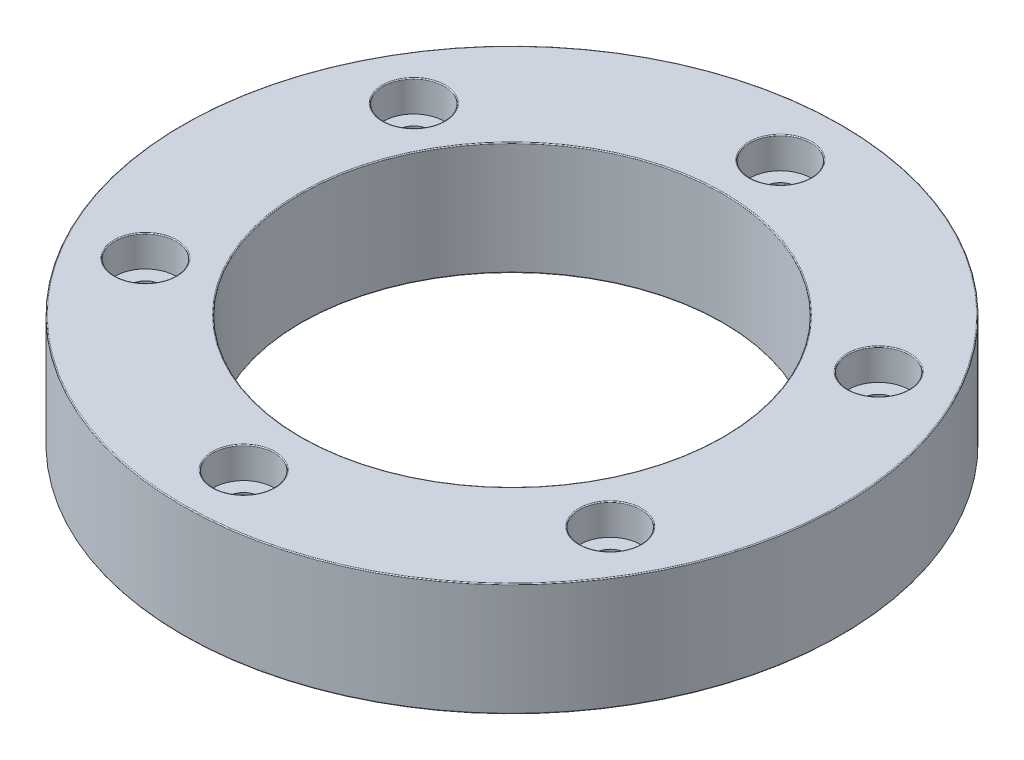
ISO-10303-21;
HEADER;
FILE_DESCRIPTION(('STEP AP214'),'2;1');
FILE_NAME('part.step','',(''),(''),'','','');
FILE_SCHEMA(('AUTOMOTIVE_DESIGN { 1 0 10303 214 1 1 1 1 }'));
ENDSEC;
DATA;
#1=APPLICATION_CONTEXT('core data for automotive mechanical design processes');
#2=APPLICATION_PROTOCOL_DEFINITION('international standard','automotive_design',2000,#1);
#3=PRODUCT_CONTEXT('',#1,'mechanical');
#4=PRODUCT('Part','Part','',(#3));
#5=PRODUCT_RELATED_PRODUCT_CATEGORY('part','',(#4));
#6=PRODUCT_DEFINITION_FORMATION('','',#4);
#7=PRODUCT_DEFINITION_CONTEXT('part definition',#1,'design');
#8=PRODUCT_DEFINITION('design','',#6,#7);
#9=PRODUCT_DEFINITION_SHAPE('','',#8);
#10=(LENGTH_UNIT() NAMED_UNIT(*) SI_UNIT(.MILLI.,.METRE.));
#11=(NAMED_UNIT(*) PLANE_ANGLE_UNIT() SI_UNIT($,.RADIAN.));
#12=(NAMED_UNIT(*) SI_UNIT($,.STERADIAN.) SOLID_ANGLE_UNIT());
#13=UNCERTAINTY_MEASURE_WITH_UNIT(LENGTH_MEASURE(1.E-05),#10,'distance_accuracy_value','');
#14=(GEOMETRIC_REPRESENTATION_CONTEXT(3) GLOBAL_UNCERTAINTY_ASSIGNED_CONTEXT((#13)) GLOBAL_UNIT_ASSIGNED_CONTEXT((#10,
#11,#12)) REPRESENTATION_CONTEXT('',''));
#15=CARTESIAN_POINT('',(0.,0.,0.));
#16=DIRECTION('',(0.,0.,1.));
#17=DIRECTION('',(1.,0.,0.));
#18=AXIS2_PLACEMENT_3D('',#15,#16,#17);
#19=CARTESIAN_POINT('',(0.,12.,0.));
#20=DIRECTION('',(0.,1.,0.));
#21=DIRECTION('',(0.,0.,1.));
#22=AXIS2_PLACEMENT_3D('',#19,#20,#21);
#23=PLANE('',#22);
#24=CARTESIAN_POINT('',(-24.6817240078563,12.,-14.2500000000003));
#25=DIRECTION('',(0.,1.,0.));
#26=DIRECTION('',(0.,0.,1.));
#27=AXIS2_PLACEMENT_3D('',#24,#25,#26);
#28=CIRCLE('',#27,3.35);
#29=CARTESIAN_POINT('',(-24.6817240078563,12.,-10.9000000000003));
#30=VERTEX_POINT('',#29);
#31=EDGE_CURVE('E62',#30,#30,#28,.F.);
#32=ORIENTED_EDGE('',*,*,#31,.T.);
#33=EDGE_LOOP('',(#32));
#34=FACE_BOUND('',#33,.T.);
#35=CARTESIAN_POINT('',(-24.6817240078566,12.,14.2499999999998));
#36=DIRECTION('',(0.,1.,0.));
#37=DIRECTION('',(0.,0.,1.));
#38=AXIS2_PLACEMENT_3D('',#35,#36,#37);
#39=CIRCLE('',#38,3.35);
#40=CARTESIAN_POINT('',(-24.6817240078566,12.,17.5999999999998));
#41=VERTEX_POINT('',#40);
#42=EDGE_CURVE('E65',#41,#41,#39,.F.);
#43=ORIENTED_EDGE('',*,*,#42,.T.);
#44=EDGE_LOOP('',(#43));
#45=FACE_BOUND('',#44,.T.);
#46=CARTESIAN_POINT('',(-1.99014436314059E-13,12.,28.5));
#47=DIRECTION('',(0.,1.,0.));
#48=DIRECTION('',(0.,0.,1.));
#49=AXIS2_PLACEMENT_3D('',#46,#47,#48);
#50=CIRCLE('',#49,3.35);
#51=CARTESIAN_POINT('',(-1.99014436314059E-13,12.,31.85));
#52=VERTEX_POINT('',#51);
#53=EDGE_CURVE('E68',#52,#52,#50,.F.);
#54=ORIENTED_EDGE('',*,*,#53,.T.);
#55=EDGE_LOOP('',(#54));
#56=FACE_BOUND('',#55,.T.);
#57=CARTESIAN_POINT('',(0.,12.,-28.5));
#58=DIRECTION('',(0.,1.,0.));
#59=DIRECTION('',(0.,0.,1.));
#60=AXIS2_PLACEMENT_3D('',#57,#58,#59);
#61=CIRCLE('',#60,3.35);
#62=CARTESIAN_POINT('',(0.,12.,-25.15));
#63=VERTEX_POINT('',#62);
#64=EDGE_CURVE('E71',#63,#63,#61,.F.);
#65=ORIENTED_EDGE('',*,*,#64,.T.);
#66=EDGE_LOOP('',(#65));
#67=FACE_BOUND('',#66,.T.);
#68=CARTESIAN_POINT('',(24.6817240078565,12.,-14.2499999999999));
#69=DIRECTION('',(0.,1.,0.));
#70=DIRECTION('',(0.,0.,1.));
#71=AXIS2_PLACEMENT_3D('',#68,#69,#70);
#72=CIRCLE('',#71,3.35);
#73=CARTESIAN_POINT('',(24.6817240078565,12.,-10.8999999999999));
#74=VERTEX_POINT('',#73);
#75=EDGE_CURVE('E74',#74,#74,#72,.F.);
#76=ORIENTED_EDGE('',*,*,#75,.T.);
#77=EDGE_LOOP('',(#76));
#78=FACE_BOUND('',#77,.T.);
#79=CARTESIAN_POINT('',(24.6817240078564,12.,14.2500000000001));
#80=DIRECTION('',(0.,1.,0.));
#81=DIRECTION('',(0.,0.,1.));
#82=AXIS2_PLACEMENT_3D('',#79,#80,#81);
#83=CIRCLE('',#82,3.35);
#84=CARTESIAN_POINT('',(24.6817240078564,12.,17.6000000000001));
#85=VERTEX_POINT('',#84);
#86=EDGE_CURVE('E77',#85,#85,#83,.F.);
#87=ORIENTED_EDGE('',*,*,#86,.T.);
#88=EDGE_LOOP('',(#87));
#89=FACE_BOUND('',#88,.T.);
#90=CARTESIAN_POINT('',(0.,12.,0.));
#91=DIRECTION('',(0.,1.,0.));
#92=DIRECTION('',(0.,0.,1.));
#93=AXIS2_PLACEMENT_3D('',#90,#91,#92);
#94=CIRCLE('',#93,34.9);
#95=CARTESIAN_POINT('',(0.,12.,34.9));
#96=VERTEX_POINT('',#95);
#97=EDGE_CURVE('E89',#96,#96,#94,.T.);
#98=ORIENTED_EDGE('',*,*,#97,.T.);
#99=EDGE_LOOP('',(#98));
#100=FACE_BOUND('',#99,.T.);
#101=CARTESIAN_POINT('',(0.,12.,0.));
#102=DIRECTION('',(0.,1.,0.));
#103=DIRECTION('',(0.,0.,1.));
#104=AXIS2_PLACEMENT_3D('',#101,#102,#103);
#105=CIRCLE('',#104,22.5);
#106=CARTESIAN_POINT('',(0.,12.,22.5));
#107=VERTEX_POINT('',#106);
#108=EDGE_CURVE('E92',#107,#107,#105,.F.);
#109=ORIENTED_EDGE('',*,*,#108,.T.);
#110=EDGE_LOOP('',(#109));
#111=FACE_BOUND('',#110,.T.);
#112=ADVANCED_FACE('F39',(#34,#45,#56,#67,#78,#89,#100,#111),#23,.T.);
#113=CARTESIAN_POINT('',(0.,0.,0.));
#114=DIRECTION('',(0.,1.,0.));
#115=DIRECTION('',(0.,0.,1.));
#116=AXIS2_PLACEMENT_3D('',#113,#114,#115);
#117=PLANE('',#116);
#118=CARTESIAN_POINT('',(0.,0.,0.));
#119=DIRECTION('',(0.,1.,0.));
#120=DIRECTION('',(0.,0.,1.));
#121=AXIS2_PLACEMENT_3D('',#118,#119,#120);
#122=CIRCLE('',#121,34.9);
#123=CARTESIAN_POINT('',(0.,0.,34.9));
#124=VERTEX_POINT('',#123);
#125=EDGE_CURVE('E95',#124,#124,#122,.F.);
#126=ORIENTED_EDGE('',*,*,#125,.T.);
#127=EDGE_LOOP('',(#126));
#128=FACE_BOUND('',#127,.T.);
#129=CARTESIAN_POINT('',(0.,0.,0.));
#130=DIRECTION('',(0.,1.,0.));
#131=DIRECTION('',(0.,0.,1.));
#132=AXIS2_PLACEMENT_3D('',#129,#130,#131);
#133=CIRCLE('',#132,22.5);
#134=CARTESIAN_POINT('',(0.,0.,22.5));
#135=VERTEX_POINT('',#134);
#136=EDGE_CURVE('E98',#135,#135,#133,.T.);
#137=ORIENTED_EDGE('',*,*,#136,.T.);
#138=EDGE_LOOP('',(#137));
#139=FACE_BOUND('',#138,.T.);
#140=CARTESIAN_POINT('',(-24.6817240078566,0.,14.2499999999998));
#141=DIRECTION('',(0.,1.,0.));
#142=DIRECTION('',(0.,0.,1.));
#143=AXIS2_PLACEMENT_3D('',#140,#141,#142);
#144=CIRCLE('',#143,1.7);
#145=CARTESIAN_POINT('',(-24.6817240078566,0.,15.9499999999998));
#146=VERTEX_POINT('',#145);
#147=EDGE_CURVE('E147',#146,#146,#144,.F.);
#148=ORIENTED_EDGE('',*,*,#147,.F.);
#149=EDGE_LOOP('',(#148));
#150=FACE_BOUND('',#149,.T.);
#151=CARTESIAN_POINT('',(-1.99014436314059E-13,0.,28.5));
#152=DIRECTION('',(0.,1.,0.));
#153=DIRECTION('',(0.,0.,1.));
#154=AXIS2_PLACEMENT_3D('',#151,#152,#153);
#155=CIRCLE('',#154,1.7);
#156=CARTESIAN_POINT('',(-1.99014436314059E-13,0.,30.2));
#157=VERTEX_POINT('',#156);
#158=EDGE_CURVE('E150',#157,#157,#155,.F.);
#159=ORIENTED_EDGE('',*,*,#158,.F.);
#160=EDGE_LOOP('',(#159));
#161=FACE_BOUND('',#160,.T.);
#162=CARTESIAN_POINT('',(24.6817240078564,0.,14.2500000000001));
#163=DIRECTION('',(0.,1.,0.));
#164=DIRECTION('',(0.,0.,1.));
#165=AXIS2_PLACEMENT_3D('',#162,#163,#164);
#166=CIRCLE('',#165,1.7);
#167=CARTESIAN_POINT('',(24.6817240078564,0.,15.9500000000001));
#168=VERTEX_POINT('',#167);
#169=EDGE_CURVE('E153',#168,#168,#166,.F.);
#170=ORIENTED_EDGE('',*,*,#169,.F.);
#171=EDGE_LOOP('',(#170));
#172=FACE_BOUND('',#171,.T.);
#173=CARTESIAN_POINT('',(24.6817240078565,0.,-14.2499999999999));
#174=DIRECTION('',(0.,1.,0.));
#175=DIRECTION('',(0.,0.,1.));
#176=AXIS2_PLACEMENT_3D('',#173,#174,#175);
#177=CIRCLE('',#176,1.7);
#178=CARTESIAN_POINT('',(24.6817240078565,0.,-12.5499999999999));
#179=VERTEX_POINT('',#178);
#180=EDGE_CURVE('E156',#179,#179,#177,.F.);
#181=ORIENTED_EDGE('',*,*,#180,.F.);
#182=EDGE_LOOP('',(#181));
#183=FACE_BOUND('',#182,.T.);
#184=CARTESIAN_POINT('',(0.,0.,-28.5));
#185=DIRECTION('',(0.,1.,0.));
#186=DIRECTION('',(0.,0.,1.));
#187=AXIS2_PLACEMENT_3D('',#184,#185,#186);
#188=CIRCLE('',#187,1.7);
#189=CARTESIAN_POINT('',(0.,0.,-26.8));
#190=VERTEX_POINT('',#189);
#191=EDGE_CURVE('E146',#190,#190,#188,.F.);
#192=ORIENTED_EDGE('',*,*,#191,.F.);
#193=EDGE_LOOP('',(#192));
#194=FACE_BOUND('',#193,.T.);
#195=CARTESIAN_POINT('',(-24.6817240078563,0.,-14.2500000000003));
#196=DIRECTION('',(0.,1.,0.));
#197=DIRECTION('',(0.,0.,1.));
#198=AXIS2_PLACEMENT_3D('',#195,#196,#197);
#199=CIRCLE('',#198,1.7);
#200=CARTESIAN_POINT('',(-24.6817240078563,0.,-12.5500000000003));
#201=VERTEX_POINT('',#200);
#202=EDGE_CURVE('E127',#201,#201,#199,.F.);
#203=ORIENTED_EDGE('',*,*,#202,.F.);
#204=EDGE_LOOP('',(#203));
#205=FACE_BOUND('',#204,.T.);
#206=ADVANCED_FACE('F164',(#128,#139,#150,#161,#172,#183,#194,#205),#117,.F.);
#207=CARTESIAN_POINT('',(0.,12.,0.));
#208=DIRECTION('',(0.,-1.,0.));
#209=DIRECTION('',(0.,0.,-1.));
#210=AXIS2_PLACEMENT_3D('',#207,#208,#209);
#211=CYLINDRICAL_SURFACE('',#210,35.);
#212=CARTESIAN_POINT('',(0.,0.0999999999999994,0.));
#213=DIRECTION('',(0.,1.,0.));
#214=DIRECTION('',(0.,0.,1.));
#215=AXIS2_PLACEMENT_3D('',#212,#213,#214);
#216=CIRCLE('',#215,35.);
#217=CARTESIAN_POINT('',(0.,0.0999999999999994,35.));
#218=VERTEX_POINT('',#217);
#219=EDGE_CURVE('E101',#218,#218,#216,.T.);
#220=ORIENTED_EDGE('',*,*,#219,.T.);
#221=EDGE_LOOP('',(#220));
#222=FACE_BOUND('',#221,.T.);
#223=CARTESIAN_POINT('',(0.,11.9,0.));
#224=DIRECTION('',(0.,1.,0.));
#225=DIRECTION('',(0.,0.,1.));
#226=AXIS2_PLACEMENT_3D('',#223,#224,#225);
#227=CIRCLE('',#226,35.);
#228=CARTESIAN_POINT('',(0.,11.9,35.));
#229=VERTEX_POINT('',#228);
#230=EDGE_CURVE('E104',#229,#229,#227,.F.);
#231=ORIENTED_EDGE('',*,*,#230,.T.);
#232=EDGE_LOOP('',(#231));
#233=FACE_BOUND('',#232,.T.);
#234=ADVANCED_FACE('F167',(#222,#233),#211,.T.);
#235=CARTESIAN_POINT('',(0.,12.,0.));
#236=DIRECTION('',(0.,-1.,0.));
#237=DIRECTION('',(0.,0.,-1.));
#238=AXIS2_PLACEMENT_3D('',#235,#236,#237);
#239=CYLINDRICAL_SURFACE('',#238,22.4);
#240=CARTESIAN_POINT('',(0.,0.0999999999999994,0.));
#241=DIRECTION('',(0.,1.,0.));
#242=DIRECTION('',(0.,0.,1.));
#243=AXIS2_PLACEMENT_3D('',#240,#241,#242);
#244=CIRCLE('',#243,22.4);
#245=CARTESIAN_POINT('',(0.,0.0999999999999994,22.4));
#246=VERTEX_POINT('',#245);
#247=EDGE_CURVE('E83',#246,#246,#244,.F.);
#248=ORIENTED_EDGE('',*,*,#247,.T.);
#249=EDGE_LOOP('',(#248));
#250=FACE_BOUND('',#249,.T.);
#251=CARTESIAN_POINT('',(0.,11.9,0.));
#252=DIRECTION('',(0.,1.,0.));
#253=DIRECTION('',(0.,0.,1.));
#254=AXIS2_PLACEMENT_3D('',#251,#252,#253);
#255=CIRCLE('',#254,22.4);
#256=CARTESIAN_POINT('',(0.,11.9,22.4));
#257=VERTEX_POINT('',#256);
#258=EDGE_CURVE('E86',#257,#257,#255,.T.);
#259=ORIENTED_EDGE('',*,*,#258,.T.);
#260=EDGE_LOOP('',(#259));
#261=FACE_BOUND('',#260,.T.);
#262=ADVANCED_FACE('F197',(#250,#261),#239,.F.);
#263=CARTESIAN_POINT('',(24.6817240078564,8.7,14.2500000000001));
#264=DIRECTION('',(0.,1.,0.));
#265=DIRECTION('',(0.,0.,1.));
#266=AXIS2_PLACEMENT_3D('',#263,#264,#265);
#267=CYLINDRICAL_SURFACE('',#266,3.25);
#268=CARTESIAN_POINT('',(24.6817240078564,11.9,14.2500000000001));
#269=DIRECTION('',(0.,1.,0.));
#270=DIRECTION('',(0.,0.,1.));
#271=AXIS2_PLACEMENT_3D('',#268,#269,#270);
#272=CIRCLE('',#271,3.25);
#273=CARTESIAN_POINT('',(24.6817240078564,11.9,17.5000000000001));
#274=VERTEX_POINT('',#273);
#275=EDGE_CURVE('E10',#274,#274,#272,.T.);
#276=ORIENTED_EDGE('',*,*,#275,.T.);
#277=EDGE_LOOP('',(#276));
#278=FACE_BOUND('',#277,.T.);
#279=CARTESIAN_POINT('',(24.6817240078564,8.7,14.2500000000001));
#280=DIRECTION('',(0.,1.,0.));
#281=DIRECTION('',(0.,0.,1.));
#282=AXIS2_PLACEMENT_3D('',#279,#280,#281);
#283=CIRCLE('',#282,3.25);
#284=CARTESIAN_POINT('',(24.6817240078564,8.7,17.5000000000001));
#285=VERTEX_POINT('',#284);
#286=EDGE_CURVE('E107',#285,#285,#283,.T.);
#287=ORIENTED_EDGE('',*,*,#286,.F.);
#288=EDGE_LOOP('',(#287));
#289=FACE_BOUND('',#288,.T.);
#290=ADVANCED_FACE('F254',(#278,#289),#267,.F.);
#291=CARTESIAN_POINT('',(24.6817240078564,8.7,14.2500000000001));
#292=DIRECTION('',(0.,1.,0.));
#293=DIRECTION('',(0.,0.,1.));
#294=AXIS2_PLACEMENT_3D('',#291,#292,#293);
#295=PLANE('',#294);
#296=CARTESIAN_POINT('',(24.6817240078564,8.7,14.2500000000001));
#297=DIRECTION('',(0.,1.,0.));
#298=DIRECTION('',(0.,0.,1.));
#299=AXIS2_PLACEMENT_3D('',#296,#297,#298);
#300=CIRCLE('',#299,1.7);
#301=CARTESIAN_POINT('',(24.6817240078564,8.7,15.9500000000001));
#302=VERTEX_POINT('',#301);
#303=EDGE_CURVE('E108',#302,#302,#300,.T.);
#304=ORIENTED_EDGE('',*,*,#303,.F.);
#305=EDGE_LOOP('',(#304));
#306=FACE_BOUND('',#305,.T.);
#307=ORIENTED_EDGE('',*,*,#286,.T.);
#308=EDGE_LOOP('',(#307));
#309=FACE_BOUND('',#308,.T.);
#310=ADVANCED_FACE('F258',(#306,#309),#295,.T.);
#311=CARTESIAN_POINT('',(24.6817240078565,8.7,-14.2499999999999));
#312=DIRECTION('',(0.,1.,0.));
#313=DIRECTION('',(0.,0.,1.));
#314=AXIS2_PLACEMENT_3D('',#311,#312,#313);
#315=CYLINDRICAL_SURFACE('',#314,3.25);
#316=CARTESIAN_POINT('',(24.6817240078565,11.9,-14.2499999999999));
#317=DIRECTION('',(0.,1.,0.));
#318=DIRECTION('',(0.,0.,1.));
#319=AXIS2_PLACEMENT_3D('',#316,#317,#318);
#320=CIRCLE('',#319,3.25);
#321=CARTESIAN_POINT('',(24.6817240078565,11.9,-10.9999999999999));
#322=VERTEX_POINT('',#321);
#323=EDGE_CURVE('E46',#322,#322,#320,.T.);
#324=ORIENTED_EDGE('',*,*,#323,.T.);
#325=EDGE_LOOP('',(#324));
#326=FACE_BOUND('',#325,.T.);
#327=CARTESIAN_POINT('',(24.6817240078565,8.7,-14.2499999999999));
#328=DIRECTION('',(0.,1.,0.));
#329=DIRECTION('',(0.,0.,1.));
#330=AXIS2_PLACEMENT_3D('',#327,#328,#329);
#331=CIRCLE('',#330,3.25);
#332=CARTESIAN_POINT('',(24.6817240078565,8.7,-10.9999999999999));
#333=VERTEX_POINT('',#332);
#334=EDGE_CURVE('E130',#333,#333,#331,.T.);
#335=ORIENTED_EDGE('',*,*,#334,.F.);
#336=EDGE_LOOP('',(#335));
#337=FACE_BOUND('',#336,.T.);
#338=ADVANCED_FACE('F309',(#326,#337),#315,.F.);
#339=CARTESIAN_POINT('',(24.6817240078565,8.7,-14.2499999999999));
#340=DIRECTION('',(0.,1.,0.));
#341=DIRECTION('',(0.,0.,1.));
#342=AXIS2_PLACEMENT_3D('',#339,#340,#341);
#343=PLANE('',#342);
#344=CARTESIAN_POINT('',(24.6817240078565,8.7,-14.2499999999999));
#345=DIRECTION('',(0.,1.,0.));
#346=DIRECTION('',(0.,0.,1.));
#347=AXIS2_PLACEMENT_3D('',#344,#345,#346);
#348=CIRCLE('',#347,1.7);
#349=CARTESIAN_POINT('',(24.6817240078565,8.7,-12.5499999999999));
#350=VERTEX_POINT('',#349);
#351=EDGE_CURVE('E112',#350,#350,#348,.T.);
#352=ORIENTED_EDGE('',*,*,#351,.F.);
#353=EDGE_LOOP('',(#352));
#354=FACE_BOUND('',#353,.T.);
#355=ORIENTED_EDGE('',*,*,#334,.T.);
#356=EDGE_LOOP('',(#355));
#357=FACE_BOUND('',#356,.T.);
#358=ADVANCED_FACE('F315',(#354,#357),#343,.T.);
#359=CARTESIAN_POINT('',(0.,8.7,-28.5));
#360=DIRECTION('',(0.,1.,0.));
#361=DIRECTION('',(0.,0.,1.));
#362=AXIS2_PLACEMENT_3D('',#359,#360,#361);
#363=CYLINDRICAL_SURFACE('',#362,3.25);
#364=CARTESIAN_POINT('',(0.,11.9,-28.5));
#365=DIRECTION('',(0.,1.,0.));
#366=DIRECTION('',(0.,0.,1.));
#367=AXIS2_PLACEMENT_3D('',#364,#365,#366);
#368=CIRCLE('',#367,3.25);
#369=CARTESIAN_POINT('',(0.,11.9,-25.25));
#370=VERTEX_POINT('',#369);
#371=EDGE_CURVE('E50',#370,#370,#368,.T.);
#372=ORIENTED_EDGE('',*,*,#371,.T.);
#373=EDGE_LOOP('',(#372));
#374=FACE_BOUND('',#373,.T.);
#375=CARTESIAN_POINT('',(0.,8.7,-28.5));
#376=DIRECTION('',(0.,1.,0.));
#377=DIRECTION('',(0.,0.,1.));
#378=AXIS2_PLACEMENT_3D('',#375,#376,#377);
#379=CIRCLE('',#378,3.25);
#380=CARTESIAN_POINT('',(0.,8.7,-25.25));
#381=VERTEX_POINT('',#380);
#382=EDGE_CURVE('E139',#381,#381,#379,.T.);
#383=ORIENTED_EDGE('',*,*,#382,.F.);
#384=EDGE_LOOP('',(#383));
#385=FACE_BOUND('',#384,.T.);
#386=ADVANCED_FACE('F324',(#374,#385),#363,.F.);
#387=CARTESIAN_POINT('',(0.,8.7,-28.5));
#388=DIRECTION('',(0.,1.,0.));
#389=DIRECTION('',(0.,0.,1.));
#390=AXIS2_PLACEMENT_3D('',#387,#388,#389);
#391=PLANE('',#390);
#392=CARTESIAN_POINT('',(0.,8.7,-28.5));
#393=DIRECTION('',(0.,1.,0.));
#394=DIRECTION('',(0.,0.,1.));
#395=AXIS2_PLACEMENT_3D('',#392,#393,#394);
#396=CIRCLE('',#395,1.7);
#397=CARTESIAN_POINT('',(0.,8.7,-26.8));
#398=VERTEX_POINT('',#397);
#399=EDGE_CURVE('E115',#398,#398,#396,.T.);
#400=ORIENTED_EDGE('',*,*,#399,.F.);
#401=EDGE_LOOP('',(#400));
#402=FACE_BOUND('',#401,.T.);
#403=ORIENTED_EDGE('',*,*,#382,.T.);
#404=EDGE_LOOP('',(#403));
#405=FACE_BOUND('',#404,.T.);
#406=ADVANCED_FACE('F330',(#402,#405),#391,.T.);
#407=CARTESIAN_POINT('',(-24.6817240078563,8.7,-14.2500000000003));
#408=DIRECTION('',(0.,1.,0.));
#409=DIRECTION('',(0.,0.,1.));
#410=AXIS2_PLACEMENT_3D('',#407,#408,#409);
#411=CYLINDRICAL_SURFACE('',#410,3.25);
#412=CARTESIAN_POINT('',(-24.6817240078563,11.9,-14.2500000000003));
#413=DIRECTION('',(0.,1.,0.));
#414=DIRECTION('',(0.,0.,1.));
#415=AXIS2_PLACEMENT_3D('',#412,#413,#414);
#416=CIRCLE('',#415,3.25);
#417=CARTESIAN_POINT('',(-24.6817240078563,11.9,-11.0000000000003));
#418=VERTEX_POINT('',#417);
#419=EDGE_CURVE('E80',#418,#418,#416,.T.);
#420=ORIENTED_EDGE('',*,*,#419,.T.);
#421=EDGE_LOOP('',(#420));
#422=FACE_BOUND('',#421,.T.);
#423=CARTESIAN_POINT('',(-24.6817240078563,8.7,-14.2500000000003));
#424=DIRECTION('',(0.,1.,0.));
#425=DIRECTION('',(0.,0.,1.));
#426=AXIS2_PLACEMENT_3D('',#423,#424,#425);
#427=CIRCLE('',#426,3.25);
#428=CARTESIAN_POINT('',(-24.6817240078563,8.7,-11.0000000000003));
#429=VERTEX_POINT('',#428);
#430=EDGE_CURVE('E136',#429,#429,#427,.T.);
#431=ORIENTED_EDGE('',*,*,#430,.F.);
#432=EDGE_LOOP('',(#431));
#433=FACE_BOUND('',#432,.T.);
#434=ADVANCED_FACE('F334',(#422,#433),#411,.F.);
#435=CARTESIAN_POINT('',(-24.6817240078563,8.7,-14.2500000000003));
#436=DIRECTION('',(0.,1.,0.));
#437=DIRECTION('',(0.,0.,1.));
#438=AXIS2_PLACEMENT_3D('',#435,#436,#437);
#439=PLANE('',#438);
#440=CARTESIAN_POINT('',(-24.6817240078563,8.7,-14.2500000000003));
#441=DIRECTION('',(0.,1.,0.));
#442=DIRECTION('',(0.,0.,1.));
#443=AXIS2_PLACEMENT_3D('',#440,#441,#442);
#444=CIRCLE('',#443,1.7);
#445=CARTESIAN_POINT('',(-24.6817240078563,8.7,-12.5500000000003));
#446=VERTEX_POINT('',#445);
#447=EDGE_CURVE('E118',#446,#446,#444,.T.);
#448=ORIENTED_EDGE('',*,*,#447,.F.);
#449=EDGE_LOOP('',(#448));
#450=FACE_BOUND('',#449,.T.);
#451=ORIENTED_EDGE('',*,*,#430,.T.);
#452=EDGE_LOOP('',(#451));
#453=FACE_BOUND('',#452,.T.);
#454=ADVANCED_FACE('F338',(#450,#453),#439,.T.);
#455=CARTESIAN_POINT('',(-24.6817240078566,8.7,14.2499999999998));
#456=DIRECTION('',(0.,1.,0.));
#457=DIRECTION('',(0.,0.,1.));
#458=AXIS2_PLACEMENT_3D('',#455,#456,#457);
#459=CYLINDRICAL_SURFACE('',#458,3.25);
#460=CARTESIAN_POINT('',(-24.6817240078566,11.9,14.2499999999998));
#461=DIRECTION('',(0.,1.,0.));
#462=DIRECTION('',(0.,0.,1.));
#463=AXIS2_PLACEMENT_3D('',#460,#461,#462);
#464=CIRCLE('',#463,3.25);
#465=CARTESIAN_POINT('',(-24.6817240078566,11.9,17.4999999999998));
#466=VERTEX_POINT('',#465);
#467=EDGE_CURVE('E59',#466,#466,#464,.T.);
#468=ORIENTED_EDGE('',*,*,#467,.T.);
#469=EDGE_LOOP('',(#468));
#470=FACE_BOUND('',#469,.T.);
#471=CARTESIAN_POINT('',(-24.6817240078566,8.7,14.2499999999998));
#472=DIRECTION('',(0.,1.,0.));
#473=DIRECTION('',(0.,0.,1.));
#474=AXIS2_PLACEMENT_3D('',#471,#472,#473);
#475=CIRCLE('',#474,3.25);
#476=CARTESIAN_POINT('',(-24.6817240078566,8.7,17.4999999999998));
#477=VERTEX_POINT('',#476);
#478=EDGE_CURVE('E133',#477,#477,#475,.T.);
#479=ORIENTED_EDGE('',*,*,#478,.F.);
#480=EDGE_LOOP('',(#479));
#481=FACE_BOUND('',#480,.T.);
#482=ADVANCED_FACE('F303',(#470,#481),#459,.F.);
#483=CARTESIAN_POINT('',(-24.6817240078566,8.7,14.2499999999998));
#484=DIRECTION('',(0.,1.,0.));
#485=DIRECTION('',(0.,0.,1.));
#486=AXIS2_PLACEMENT_3D('',#483,#484,#485);
#487=PLANE('',#486);
#488=CARTESIAN_POINT('',(-24.6817240078566,8.7,14.2499999999998));
#489=DIRECTION('',(0.,1.,0.));
#490=DIRECTION('',(0.,0.,1.));
#491=AXIS2_PLACEMENT_3D('',#488,#489,#490);
#492=CIRCLE('',#491,1.7);
#493=CARTESIAN_POINT('',(-24.6817240078566,8.7,15.9499999999998));
#494=VERTEX_POINT('',#493);
#495=EDGE_CURVE('E121',#494,#494,#492,.T.);
#496=ORIENTED_EDGE('',*,*,#495,.F.);
#497=EDGE_LOOP('',(#496));
#498=FACE_BOUND('',#497,.T.);
#499=ORIENTED_EDGE('',*,*,#478,.T.);
#500=EDGE_LOOP('',(#499));
#501=FACE_BOUND('',#500,.T.);
#502=ADVANCED_FACE('F296',(#498,#501),#487,.T.);
#503=CARTESIAN_POINT('',(-1.99014436314059E-13,8.7,28.5));
#504=DIRECTION('',(0.,1.,0.));
#505=DIRECTION('',(0.,0.,1.));
#506=AXIS2_PLACEMENT_3D('',#503,#504,#505);
#507=CYLINDRICAL_SURFACE('',#506,3.25);
#508=CARTESIAN_POINT('',(-1.99014436314059E-13,11.9,28.5));
#509=DIRECTION('',(0.,1.,0.));
#510=DIRECTION('',(0.,0.,1.));
#511=AXIS2_PLACEMENT_3D('',#508,#509,#510);
#512=CIRCLE('',#511,3.25);
#513=CARTESIAN_POINT('',(-1.99014436314059E-13,11.9,31.75));
#514=VERTEX_POINT('',#513);
#515=EDGE_CURVE('E54',#514,#514,#512,.T.);
#516=ORIENTED_EDGE('',*,*,#515,.T.);
#517=EDGE_LOOP('',(#516));
#518=FACE_BOUND('',#517,.T.);
#519=CARTESIAN_POINT('',(-1.99014436314059E-13,8.7,28.5));
#520=DIRECTION('',(0.,1.,0.));
#521=DIRECTION('',(0.,0.,1.));
#522=AXIS2_PLACEMENT_3D('',#519,#520,#521);
#523=CIRCLE('',#522,3.25);
#524=CARTESIAN_POINT('',(-1.99014436314059E-13,8.7,31.75));
#525=VERTEX_POINT('',#524);
#526=EDGE_CURVE('E111',#525,#525,#523,.T.);
#527=ORIENTED_EDGE('',*,*,#526,.F.);
#528=EDGE_LOOP('',(#527));
#529=FACE_BOUND('',#528,.T.);
#530=ADVANCED_FACE('F287',(#518,#529),#507,.F.);
#531=CARTESIAN_POINT('',(-1.99014436314059E-13,8.7,28.5));
#532=DIRECTION('',(0.,1.,0.));
#533=DIRECTION('',(0.,0.,1.));
#534=AXIS2_PLACEMENT_3D('',#531,#532,#533);
#535=PLANE('',#534);
#536=CARTESIAN_POINT('',(-1.99014436314059E-13,8.7,28.5));
#537=DIRECTION('',(0.,1.,0.));
#538=DIRECTION('',(0.,0.,1.));
#539=AXIS2_PLACEMENT_3D('',#536,#537,#538);
#540=CIRCLE('',#539,1.7);
#541=CARTESIAN_POINT('',(-1.99014436314059E-13,8.7,30.2));
#542=VERTEX_POINT('',#541);
#543=EDGE_CURVE('E124',#542,#542,#540,.T.);
#544=ORIENTED_EDGE('',*,*,#543,.F.);
#545=EDGE_LOOP('',(#544));
#546=FACE_BOUND('',#545,.T.);
#547=ORIENTED_EDGE('',*,*,#526,.T.);
#548=EDGE_LOOP('',(#547));
#549=FACE_BOUND('',#548,.T.);
#550=ADVANCED_FACE('F282',(#546,#549),#535,.T.);
#551=CARTESIAN_POINT('',(-1.99014436314059E-13,-4.80832611206853,28.5));
#552=DIRECTION('',(0.,1.,0.));
#553=DIRECTION('',(0.,0.,1.));
#554=AXIS2_PLACEMENT_3D('',#551,#552,#553);
#555=CYLINDRICAL_SURFACE('',#554,1.7);
#556=ORIENTED_EDGE('',*,*,#543,.T.);
#557=EDGE_LOOP('',(#556));
#558=FACE_BOUND('',#557,.T.);
#559=ORIENTED_EDGE('',*,*,#158,.T.);
#560=EDGE_LOOP('',(#559));
#561=FACE_BOUND('',#560,.T.);
#562=ADVANCED_FACE('F184',(#558,#561),#555,.F.);
#563=CARTESIAN_POINT('',(-24.6817240078566,-4.80832611206853,14.2499999999998));
#564=DIRECTION('',(0.,1.,0.));
#565=DIRECTION('',(0.,0.,1.));
#566=AXIS2_PLACEMENT_3D('',#563,#564,#565);
#567=CYLINDRICAL_SURFACE('',#566,1.7);
#568=ORIENTED_EDGE('',*,*,#495,.T.);
#569=EDGE_LOOP('',(#568));
#570=FACE_BOUND('',#569,.T.);
#571=ORIENTED_EDGE('',*,*,#147,.T.);
#572=EDGE_LOOP('',(#571));
#573=FACE_BOUND('',#572,.T.);
#574=ADVANCED_FACE('F174',(#570,#573),#567,.F.);
#575=CARTESIAN_POINT('',(-24.6817240078563,-4.80832611206853,-14.2500000000003));
#576=DIRECTION('',(0.,1.,0.));
#577=DIRECTION('',(0.,0.,1.));
#578=AXIS2_PLACEMENT_3D('',#575,#576,#577);
#579=CYLINDRICAL_SURFACE('',#578,1.7);
#580=ORIENTED_EDGE('',*,*,#447,.T.);
#581=EDGE_LOOP('',(#580));
#582=FACE_BOUND('',#581,.T.);
#583=ORIENTED_EDGE('',*,*,#202,.T.);
#584=EDGE_LOOP('',(#583));
#585=FACE_BOUND('',#584,.T.);
#586=ADVANCED_FACE('F172',(#582,#585),#579,.F.);
#587=CARTESIAN_POINT('',(0.,-4.80832611206853,-28.5));
#588=DIRECTION('',(0.,1.,0.));
#589=DIRECTION('',(0.,0.,1.));
#590=AXIS2_PLACEMENT_3D('',#587,#588,#589);
#591=CYLINDRICAL_SURFACE('',#590,1.7);
#592=ORIENTED_EDGE('',*,*,#399,.T.);
#593=EDGE_LOOP('',(#592));
#594=FACE_BOUND('',#593,.T.);
#595=ORIENTED_EDGE('',*,*,#191,.T.);
#596=EDGE_LOOP('',(#595));
#597=FACE_BOUND('',#596,.T.);
#598=ADVANCED_FACE('F162',(#594,#597),#591,.F.);
#599=CARTESIAN_POINT('',(24.6817240078565,-4.80832611206853,-14.2499999999999));
#600=DIRECTION('',(0.,1.,0.));
#601=DIRECTION('',(0.,0.,1.));
#602=AXIS2_PLACEMENT_3D('',#599,#600,#601);
#603=CYLINDRICAL_SURFACE('',#602,1.7);
#604=ORIENTED_EDGE('',*,*,#351,.T.);
#605=EDGE_LOOP('',(#604));
#606=FACE_BOUND('',#605,.T.);
#607=ORIENTED_EDGE('',*,*,#180,.T.);
#608=EDGE_LOOP('',(#607));
#609=FACE_BOUND('',#608,.T.);
#610=ADVANCED_FACE('F181',(#606,#609),#603,.F.);
#611=CARTESIAN_POINT('',(24.6817240078564,-4.80832611206853,14.2500000000001));
#612=DIRECTION('',(0.,1.,0.));
#613=DIRECTION('',(0.,0.,1.));
#614=AXIS2_PLACEMENT_3D('',#611,#612,#613);
#615=CYLINDRICAL_SURFACE('',#614,1.7);
#616=ORIENTED_EDGE('',*,*,#303,.T.);
#617=EDGE_LOOP('',(#616));
#618=FACE_BOUND('',#617,.T.);
#619=ORIENTED_EDGE('',*,*,#169,.T.);
#620=EDGE_LOOP('',(#619));
#621=FACE_BOUND('',#620,.T.);
#622=ADVANCED_FACE('F207',(#618,#621),#615,.F.);
#623=CARTESIAN_POINT('',(0.,0.0999999999999994,0.));
#624=DIRECTION('',(0.,1.,0.));
#625=DIRECTION('',(0.,0.,1.));
#626=AXIS2_PLACEMENT_3D('',#623,#624,#625);
#627=TOROIDAL_SURFACE('',#626,34.9,0.1);
#628=ORIENTED_EDGE('',*,*,#125,.F.);
#629=EDGE_LOOP('',(#628));
#630=FACE_BOUND('',#629,.T.);
#631=ORIENTED_EDGE('',*,*,#219,.F.);
#632=EDGE_LOOP('',(#631));
#633=FACE_BOUND('',#632,.T.);
#634=ADVANCED_FACE('F203',(#630,#633),#627,.T.);
#635=CARTESIAN_POINT('',(0.,11.9,0.));
#636=DIRECTION('',(0.,1.,0.));
#637=DIRECTION('',(0.,0.,1.));
#638=AXIS2_PLACEMENT_3D('',#635,#636,#637);
#639=TOROIDAL_SURFACE('',#638,34.9,0.1);
#640=ORIENTED_EDGE('',*,*,#230,.F.);
#641=EDGE_LOOP('',(#640));
#642=FACE_BOUND('',#641,.T.);
#643=ORIENTED_EDGE('',*,*,#97,.F.);
#644=EDGE_LOOP('',(#643));
#645=FACE_BOUND('',#644,.T.);
#646=ADVANCED_FACE('F206',(#642,#645),#639,.T.);
#647=CARTESIAN_POINT('',(0.,0.0999999999999994,0.));
#648=DIRECTION('',(0.,1.,0.));
#649=DIRECTION('',(0.,0.,1.));
#650=AXIS2_PLACEMENT_3D('',#647,#648,#649);
#651=TOROIDAL_SURFACE('',#650,22.5,0.1);
#652=ORIENTED_EDGE('',*,*,#247,.F.);
#653=EDGE_LOOP('',(#652));
#654=FACE_BOUND('',#653,.T.);
#655=ORIENTED_EDGE('',*,*,#136,.F.);
#656=EDGE_LOOP('',(#655));
#657=FACE_BOUND('',#656,.T.);
#658=ADVANCED_FACE('F211',(#654,#657),#651,.T.);
#659=CARTESIAN_POINT('',(0.,11.9,0.));
#660=DIRECTION('',(0.,1.,0.));
#661=DIRECTION('',(0.,0.,1.));
#662=AXIS2_PLACEMENT_3D('',#659,#660,#661);
#663=TOROIDAL_SURFACE('',#662,22.5,0.1);
#664=ORIENTED_EDGE('',*,*,#108,.F.);
#665=EDGE_LOOP('',(#664));
#666=FACE_BOUND('',#665,.T.);
#667=ORIENTED_EDGE('',*,*,#258,.F.);
#668=EDGE_LOOP('',(#667));
#669=FACE_BOUND('',#668,.T.);
#670=ADVANCED_FACE('F215',(#666,#669),#663,.T.);
#671=CARTESIAN_POINT('',(-24.6817240078563,11.9,-14.2500000000003));
#672=DIRECTION('',(0.,1.,0.));
#673=DIRECTION('',(0.,0.,1.));
#674=AXIS2_PLACEMENT_3D('',#671,#672,#673);
#675=TOROIDAL_SURFACE('',#674,3.35,0.1);
#676=ORIENTED_EDGE('',*,*,#31,.F.);
#677=EDGE_LOOP('',(#676));
#678=FACE_BOUND('',#677,.T.);
#679=ORIENTED_EDGE('',*,*,#419,.F.);
#680=EDGE_LOOP('',(#679));
#681=FACE_BOUND('',#680,.T.);
#682=ADVANCED_FACE('F218',(#678,#681),#675,.T.);
#683=CARTESIAN_POINT('',(-24.6817240078566,11.9,14.2499999999998));
#684=DIRECTION('',(0.,1.,0.));
#685=DIRECTION('',(0.,0.,1.));
#686=AXIS2_PLACEMENT_3D('',#683,#684,#685);
#687=TOROIDAL_SURFACE('',#686,3.35,0.1);
#688=ORIENTED_EDGE('',*,*,#42,.F.);
#689=EDGE_LOOP('',(#688));
#690=FACE_BOUND('',#689,.T.);
#691=ORIENTED_EDGE('',*,*,#467,.F.);
#692=EDGE_LOOP('',(#691));
#693=FACE_BOUND('',#692,.T.);
#694=ADVANCED_FACE('F222',(#690,#693),#687,.T.);
#695=CARTESIAN_POINT('',(-1.99014436314059E-13,11.9,28.5));
#696=DIRECTION('',(0.,1.,0.));
#697=DIRECTION('',(0.,0.,1.));
#698=AXIS2_PLACEMENT_3D('',#695,#696,#697);
#699=TOROIDAL_SURFACE('',#698,3.35,0.1);
#700=ORIENTED_EDGE('',*,*,#53,.F.);
#701=EDGE_LOOP('',(#700));
#702=FACE_BOUND('',#701,.T.);
#703=ORIENTED_EDGE('',*,*,#515,.F.);
#704=EDGE_LOOP('',(#703));
#705=FACE_BOUND('',#704,.T.);
#706=ADVANCED_FACE('F226',(#702,#705),#699,.T.);
#707=CARTESIAN_POINT('',(0.,11.9,-28.5));
#708=DIRECTION('',(0.,1.,0.));
#709=DIRECTION('',(0.,0.,1.));
#710=AXIS2_PLACEMENT_3D('',#707,#708,#709);
#711=TOROIDAL_SURFACE('',#710,3.35,0.1);
#712=ORIENTED_EDGE('',*,*,#64,.F.);
#713=EDGE_LOOP('',(#712));
#714=FACE_BOUND('',#713,.T.);
#715=ORIENTED_EDGE('',*,*,#371,.F.);
#716=EDGE_LOOP('',(#715));
#717=FACE_BOUND('',#716,.T.);
#718=ADVANCED_FACE('F230',(#714,#717),#711,.T.);
#719=CARTESIAN_POINT('',(24.6817240078565,11.9,-14.2499999999999));
#720=DIRECTION('',(0.,1.,0.));
#721=DIRECTION('',(0.,0.,1.));
#722=AXIS2_PLACEMENT_3D('',#719,#720,#721);
#723=TOROIDAL_SURFACE('',#722,3.35,0.1);
#724=ORIENTED_EDGE('',*,*,#75,.F.);
#725=EDGE_LOOP('',(#724));
#726=FACE_BOUND('',#725,.T.);
#727=ORIENTED_EDGE('',*,*,#323,.F.);
#728=EDGE_LOOP('',(#727));
#729=FACE_BOUND('',#728,.T.);
#730=ADVANCED_FACE('F233',(#726,#729),#723,.T.);
#731=CARTESIAN_POINT('',(24.6817240078564,11.9,14.2500000000001));
#732=DIRECTION('',(0.,1.,0.));
#733=DIRECTION('',(0.,0.,1.));
#734=AXIS2_PLACEMENT_3D('',#731,#732,#733);
#735=TOROIDAL_SURFACE('',#734,3.35,0.1);
#736=ORIENTED_EDGE('',*,*,#86,.F.);
#737=EDGE_LOOP('',(#736));
#738=FACE_BOUND('',#737,.T.);
#739=ORIENTED_EDGE('',*,*,#275,.F.);
#740=EDGE_LOOP('',(#739));
#741=FACE_BOUND('',#740,.T.);
#742=ADVANCED_FACE('F41',(#738,#741),#735,.T.);
#743=CLOSED_SHELL('',(#112,#206,#234,#262,#290,#310,#338,#358,#386,#406,#434,#454,#482,#502,
#530,#550,#562,#574,#586,#598,#610,#622,#634,#646,#658,#670,#682,#694,#706,#718,#730,#742));
#744=MANIFOLD_SOLID_BREP('B2',#743);
#745=ADVANCED_BREP_SHAPE_REPRESENTATION('',(#18,#744),#14);
#746=SHAPE_DEFINITION_REPRESENTATION(#9,#745);
ENDSEC;
END-ISO-10303-21;
